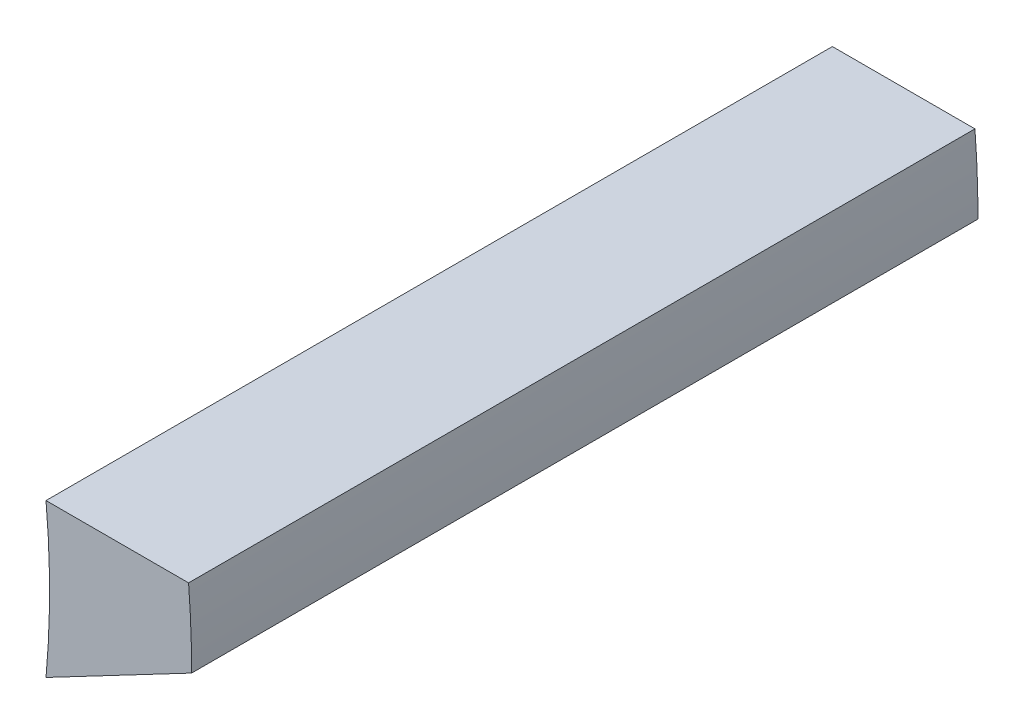
ISO-10303-21;
HEADER;
FILE_DESCRIPTION(('STEP AP214'),'2;1');
FILE_NAME('part.step','',(''),(''),'','','');
FILE_SCHEMA(('AUTOMOTIVE_DESIGN { 1 0 10303 214 1 1 1 1 }'));
ENDSEC;
DATA;
#1=APPLICATION_CONTEXT('core data for automotive mechanical design processes');
#2=APPLICATION_PROTOCOL_DEFINITION('international standard','automotive_design',2000,#1);
#3=PRODUCT_CONTEXT('',#1,'mechanical');
#4=PRODUCT('Part','Part','',(#3));
#5=PRODUCT_RELATED_PRODUCT_CATEGORY('part','',(#4));
#6=PRODUCT_DEFINITION_FORMATION('','',#4);
#7=PRODUCT_DEFINITION_CONTEXT('part definition',#1,'design');
#8=PRODUCT_DEFINITION('design','',#6,#7);
#9=PRODUCT_DEFINITION_SHAPE('','',#8);
#10=(LENGTH_UNIT() NAMED_UNIT(*) SI_UNIT(.MILLI.,.METRE.));
#11=(NAMED_UNIT(*) PLANE_ANGLE_UNIT() SI_UNIT($,.RADIAN.));
#12=(NAMED_UNIT(*) SI_UNIT($,.STERADIAN.) SOLID_ANGLE_UNIT());
#13=UNCERTAINTY_MEASURE_WITH_UNIT(LENGTH_MEASURE(1.E-05),#10,'distance_accuracy_value','');
#14=(GEOMETRIC_REPRESENTATION_CONTEXT(3) GLOBAL_UNCERTAINTY_ASSIGNED_CONTEXT((#13)) GLOBAL_UNIT_ASSIGNED_CONTEXT((#10,
#11,#12)) REPRESENTATION_CONTEXT('',''));
#15=CARTESIAN_POINT('',(0.,0.,0.));
#16=DIRECTION('',(0.,0.,1.));
#17=DIRECTION('',(1.,0.,0.));
#18=AXIS2_PLACEMENT_3D('',#15,#16,#17);
#19=CARTESIAN_POINT('',(0.,0.,18.));
#20=DIRECTION('',(0.,0.,-1.));
#21=DIRECTION('',(-1.,0.,0.));
#22=AXIS2_PLACEMENT_3D('',#19,#20,#21);
#23=CYLINDRICAL_SURFACE('',#22,18.79385);
#24=CARTESIAN_POINT('',(0.,0.,0.));
#25=DIRECTION('',(0.,0.,-1.));
#26=DIRECTION('',(1.,0.,0.));
#27=AXIS2_PLACEMENT_3D('',#24,#25,#26);
#28=CIRCLE('',#27,18.79385);
#29=CARTESIAN_POINT('',(18.7118574440171,1.75362162888188,0.));
#30=VERTEX_POINT('',#29);
#31=CARTESIAN_POINT('',(18.7118574440171,-1.75362162888188,0.));
#32=VERTEX_POINT('',#31);
#33=EDGE_CURVE('E104',#30,#32,#28,.T.);
#34=ORIENTED_EDGE('',*,*,#33,.T.);
#35=DIRECTION('',(0.,0.,-1.));
#36=VECTOR('',#35,1.);
#37=CARTESIAN_POINT('',(18.7118574440171,-1.75362162888188,18.));
#38=LINE('',#37,#36);
#39=CARTESIAN_POINT('',(18.7118574440171,-1.75362162888188,18.));
#40=VERTEX_POINT('',#39);
#41=EDGE_CURVE('E11',#40,#32,#38,.T.);
#42=ORIENTED_EDGE('',*,*,#41,.F.);
#43=CARTESIAN_POINT('',(0.,0.,18.));
#44=DIRECTION('',(0.,0.,-1.));
#45=DIRECTION('',(1.,0.,0.));
#46=AXIS2_PLACEMENT_3D('',#43,#44,#45);
#47=CIRCLE('',#46,18.79385);
#48=CARTESIAN_POINT('',(18.7118574440171,1.75362162888188,18.));
#49=VERTEX_POINT('',#48);
#50=EDGE_CURVE('E92',#49,#40,#47,.T.);
#51=ORIENTED_EDGE('',*,*,#50,.F.);
#52=DIRECTION('',(0.,0.,-1.));
#53=VECTOR('',#52,1.);
#54=CARTESIAN_POINT('',(18.7118574440171,1.75362162888188,18.));
#55=LINE('',#54,#53);
#56=EDGE_CURVE('E100',#49,#30,#55,.T.);
#57=ORIENTED_EDGE('',*,*,#56,.T.);
#58=EDGE_LOOP('',(#34,#42,#51,#57));
#59=FACE_BOUND('',#58,.T.);
#60=ADVANCED_FACE('F41',(#59),#23,.F.);
#61=CARTESIAN_POINT('',(22.0455008528632,0.,18.));
#62=DIRECTION('',(-0.465553593929265,0.885019689712915,0.));
#63=DIRECTION('',(-0.885019689712915,-0.465553593929265,0.));
#64=AXIS2_PLACEMENT_3D('',#61,#62,#63);
#65=PLANE('',#64);
#66=DIRECTION('',(0.885019689712915,0.465553593929265,0.));
#67=VECTOR('',#66,1.);
#68=CARTESIAN_POINT('',(22.0455008528632,0.,0.));
#69=LINE('',#68,#67);
#70=CARTESIAN_POINT('',(22.0455008528632,0.,0.));
#71=VERTEX_POINT('',#70);
#72=EDGE_CURVE('E96',#32,#71,#69,.T.);
#73=ORIENTED_EDGE('',*,*,#72,.T.);
#74=DIRECTION('',(0.,0.,-1.));
#75=VECTOR('',#74,1.);
#76=CARTESIAN_POINT('',(22.0455008528632,0.,18.));
#77=LINE('',#76,#75);
#78=CARTESIAN_POINT('',(22.0455008528632,0.,18.));
#79=VERTEX_POINT('',#78);
#80=EDGE_CURVE('E49',#79,#71,#77,.T.);
#81=ORIENTED_EDGE('',*,*,#80,.F.);
#82=DIRECTION('',(0.885019689712915,0.465553593929265,0.));
#83=VECTOR('',#82,1.);
#84=CARTESIAN_POINT('',(22.0455008528632,0.,18.));
#85=LINE('',#84,#83);
#86=EDGE_CURVE('E87',#40,#79,#85,.T.);
#87=ORIENTED_EDGE('',*,*,#86,.F.);
#88=ORIENTED_EDGE('',*,*,#41,.T.);
#89=EDGE_LOOP('',(#73,#81,#87,#88));
#90=FACE_BOUND('',#89,.T.);
#91=ADVANCED_FACE('F95',(#90),#65,.F.);
#92=CARTESIAN_POINT('',(0.,0.,18.));
#93=DIRECTION('',(0.,0.,-1.));
#94=DIRECTION('',(-1.,0.,0.));
#95=AXIS2_PLACEMENT_3D('',#92,#93,#94);
#96=CYLINDRICAL_SURFACE('',#95,22.0455008528632);
#97=CARTESIAN_POINT('',(0.,0.,0.));
#98=DIRECTION('',(0.,0.,1.));
#99=DIRECTION('',(-1.,0.,0.));
#100=AXIS2_PLACEMENT_3D('',#97,#98,#99);
#101=CIRCLE('',#100,22.0455008528632);
#102=CARTESIAN_POINT('',(21.9756437684157,1.75362162888188,0.));
#103=VERTEX_POINT('',#102);
#104=EDGE_CURVE('E74',#71,#103,#101,.T.);
#105=ORIENTED_EDGE('',*,*,#104,.T.);
#106=DIRECTION('',(0.,0.,-1.));
#107=VECTOR('',#106,1.);
#108=CARTESIAN_POINT('',(21.9756437684157,1.75362162888188,18.));
#109=LINE('',#108,#107);
#110=CARTESIAN_POINT('',(21.9756437684157,1.75362162888188,18.));
#111=VERTEX_POINT('',#110);
#112=EDGE_CURVE('E97',#111,#103,#109,.T.);
#113=ORIENTED_EDGE('',*,*,#112,.F.);
#114=CARTESIAN_POINT('',(0.,0.,18.));
#115=DIRECTION('',(0.,0.,1.));
#116=DIRECTION('',(-1.,0.,0.));
#117=AXIS2_PLACEMENT_3D('',#114,#115,#116);
#118=CIRCLE('',#117,22.0455008528632);
#119=EDGE_CURVE('E90',#79,#111,#118,.T.);
#120=ORIENTED_EDGE('',*,*,#119,.F.);
#121=ORIENTED_EDGE('',*,*,#80,.T.);
#122=EDGE_LOOP('',(#105,#113,#120,#121));
#123=FACE_BOUND('',#122,.T.);
#124=ADVANCED_FACE('F98',(#123),#96,.T.);
#125=CARTESIAN_POINT('',(18.7118574440171,1.75362162888188,18.));
#126=DIRECTION('',(0.,-1.,0.));
#127=DIRECTION('',(0.,0.,-1.));
#128=AXIS2_PLACEMENT_3D('',#125,#126,#127);
#129=PLANE('',#128);
#130=DIRECTION('',(-1.,0.,0.));
#131=VECTOR('',#130,1.);
#132=CARTESIAN_POINT('',(18.7118574440171,1.75362162888188,0.));
#133=LINE('',#132,#131);
#134=EDGE_CURVE('E80',#103,#30,#133,.T.);
#135=ORIENTED_EDGE('',*,*,#134,.T.);
#136=ORIENTED_EDGE('',*,*,#56,.F.);
#137=DIRECTION('',(-1.,0.,0.));
#138=VECTOR('',#137,1.);
#139=CARTESIAN_POINT('',(18.7118574440171,1.75362162888188,18.));
#140=LINE('',#139,#138);
#141=EDGE_CURVE('E57',#111,#49,#140,.T.);
#142=ORIENTED_EDGE('',*,*,#141,.F.);
#143=ORIENTED_EDGE('',*,*,#112,.T.);
#144=EDGE_LOOP('',(#135,#136,#142,#143));
#145=FACE_BOUND('',#144,.T.);
#146=ADVANCED_FACE('F111',(#145),#129,.F.);
#147=CARTESIAN_POINT('',(0.,0.,18.));
#148=DIRECTION('',(0.,0.,1.));
#149=DIRECTION('',(1.,0.,0.));
#150=AXIS2_PLACEMENT_3D('',#147,#148,#149);
#151=PLANE('',#150);
#152=ORIENTED_EDGE('',*,*,#50,.T.);
#153=ORIENTED_EDGE('',*,*,#86,.T.);
#154=ORIENTED_EDGE('',*,*,#119,.T.);
#155=ORIENTED_EDGE('',*,*,#141,.T.);
#156=EDGE_LOOP('',(#152,#153,#154,#155));
#157=FACE_BOUND('',#156,.T.);
#158=ADVANCED_FACE('F88',(#157),#151,.T.);
#159=CARTESIAN_POINT('',(0.,0.,0.));
#160=DIRECTION('',(0.,0.,1.));
#161=DIRECTION('',(1.,0.,0.));
#162=AXIS2_PLACEMENT_3D('',#159,#160,#161);
#163=PLANE('',#162);
#164=ORIENTED_EDGE('',*,*,#33,.F.);
#165=ORIENTED_EDGE('',*,*,#134,.F.);
#166=ORIENTED_EDGE('',*,*,#104,.F.);
#167=ORIENTED_EDGE('',*,*,#72,.F.);
#168=EDGE_LOOP('',(#164,#165,#166,#167));
#169=FACE_BOUND('',#168,.T.);
#170=ADVANCED_FACE('F114',(#169),#163,.F.);
#171=CLOSED_SHELL('',(#60,#91,#124,#146,#158,#170));
#172=MANIFOLD_SOLID_BREP('B2',#171);
#173=ADVANCED_BREP_SHAPE_REPRESENTATION('',(#18,#172),#14);
#174=SHAPE_DEFINITION_REPRESENTATION(#9,#173);
ENDSEC;
END-ISO-10303-21;
